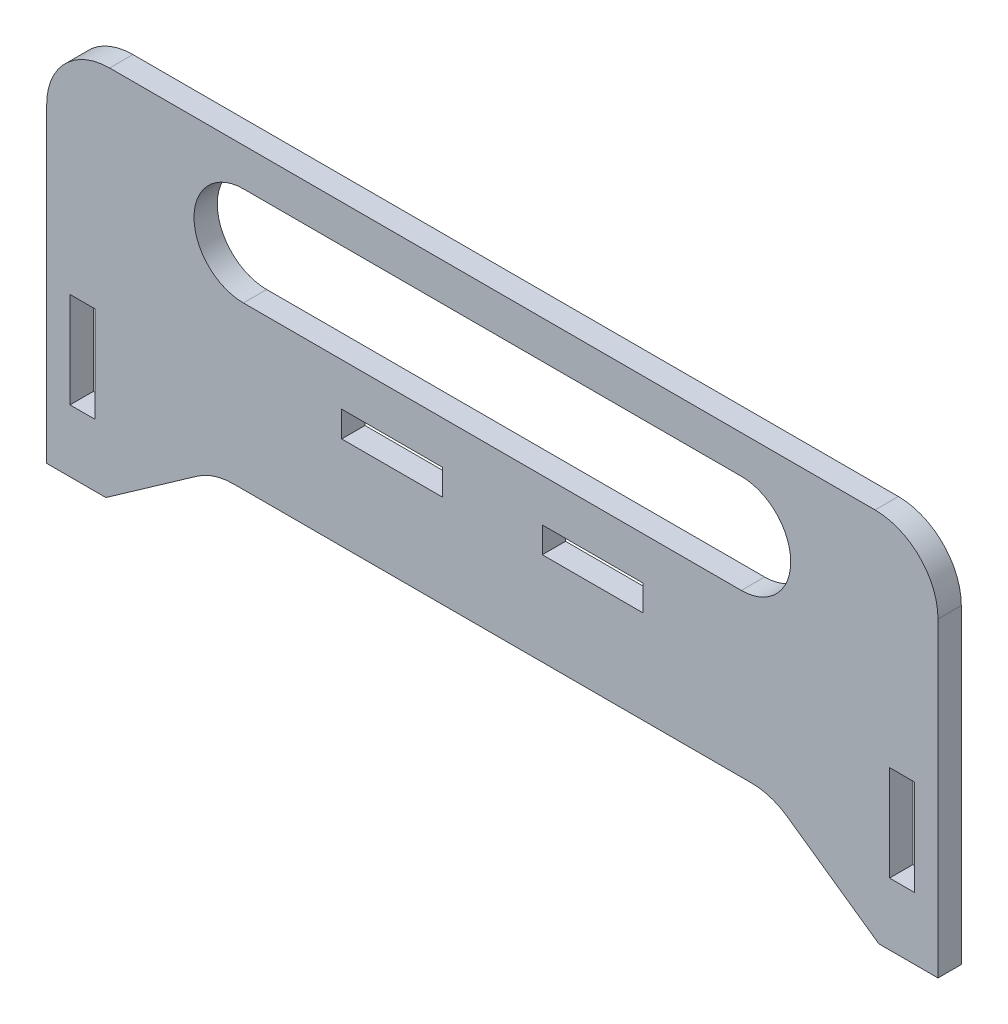
ISO-10303-21;
HEADER;
FILE_DESCRIPTION(('STEP AP214'),'2;1');
FILE_NAME('part.step','',(''),(''),'','','');
FILE_SCHEMA(('AUTOMOTIVE_DESIGN { 1 0 10303 214 1 1 1 1 }'));
ENDSEC;
DATA;
#1=APPLICATION_CONTEXT('core data for automotive mechanical design processes');
#2=APPLICATION_PROTOCOL_DEFINITION('international standard','automotive_design',2000,#1);
#3=PRODUCT_CONTEXT('',#1,'mechanical');
#4=PRODUCT('Part','Part','',(#3));
#5=PRODUCT_RELATED_PRODUCT_CATEGORY('part','',(#4));
#6=PRODUCT_DEFINITION_FORMATION('','',#4);
#7=PRODUCT_DEFINITION_CONTEXT('part definition',#1,'design');
#8=PRODUCT_DEFINITION('design','',#6,#7);
#9=PRODUCT_DEFINITION_SHAPE('','',#8);
#10=(LENGTH_UNIT() NAMED_UNIT(*) SI_UNIT(.MILLI.,.METRE.));
#11=(NAMED_UNIT(*) PLANE_ANGLE_UNIT() SI_UNIT($,.RADIAN.));
#12=(NAMED_UNIT(*) SI_UNIT($,.STERADIAN.) SOLID_ANGLE_UNIT());
#13=UNCERTAINTY_MEASURE_WITH_UNIT(LENGTH_MEASURE(1.E-05),#10,'distance_accuracy_value','');
#14=(GEOMETRIC_REPRESENTATION_CONTEXT(3) GLOBAL_UNCERTAINTY_ASSIGNED_CONTEXT((#13)) GLOBAL_UNIT_ASSIGNED_CONTEXT((#10,
#11,#12)) REPRESENTATION_CONTEXT('',''));
#15=CARTESIAN_POINT('',(0.,0.,0.));
#16=DIRECTION('',(0.,0.,1.));
#17=DIRECTION('',(1.,0.,0.));
#18=AXIS2_PLACEMENT_3D('',#15,#16,#17);
#19=CARTESIAN_POINT('',(0.,0.,3.7));
#20=DIRECTION('',(0.,0.,1.));
#21=DIRECTION('',(1.,0.,0.));
#22=AXIS2_PLACEMENT_3D('',#19,#20,#21);
#23=PLANE('',#22);
#24=DIRECTION('',(-1.,0.,0.));
#25=VECTOR('',#24,1.);
#26=CARTESIAN_POINT('',(-110.178290247756,0.,3.7));
#27=LINE('',#26,#25);
#28=CARTESIAN_POINT('',(21.4217097522439,0.,3.7));
#29=VERTEX_POINT('',#28);
#30=CARTESIAN_POINT('',(-100.178290247756,0.,3.7));
#31=VERTEX_POINT('',#30);
#32=EDGE_CURVE('E427',#29,#31,#27,.T.);
#33=ORIENTED_EDGE('',*,*,#32,.T.);
#34=CARTESIAN_POINT('',(-100.178290247756,-10.,3.7));
#35=DIRECTION('',(0.,0.,1.));
#36=DIRECTION('',(1.,0.,0.));
#37=AXIS2_PLACEMENT_3D('',#34,#35,#36);
#38=CIRCLE('',#37,10.);
#39=CARTESIAN_POINT('',(-110.178290247756,-10.,3.7));
#40=VERTEX_POINT('',#39);
#41=EDGE_CURVE('E473',#31,#40,#38,.T.);
#42=ORIENTED_EDGE('',*,*,#41,.T.);
#43=DIRECTION('',(0.,-1.,0.));
#44=VECTOR('',#43,1.);
#45=CARTESIAN_POINT('',(-110.178290247756,0.,3.7));
#46=LINE('',#45,#44);
#47=CARTESIAN_POINT('',(-110.178290247756,-59.4,3.7));
#48=VERTEX_POINT('',#47);
#49=EDGE_CURVE('E410',#40,#48,#46,.T.);
#50=ORIENTED_EDGE('',*,*,#49,.T.);
#51=DIRECTION('',(1.,0.,0.));
#52=VECTOR('',#51,1.);
#53=CARTESIAN_POINT('',(-110.178290247756,-59.4,3.7));
#54=LINE('',#53,#52);
#55=CARTESIAN_POINT('',(-100.778290247756,-59.4,3.7));
#56=VERTEX_POINT('',#55);
#57=EDGE_CURVE('E412',#48,#56,#54,.T.);
#58=ORIENTED_EDGE('',*,*,#57,.T.);
#59=DIRECTION('',(0.818181818181818,0.574959574576069,0.));
#60=VECTOR('',#59,1.);
#61=CARTESIAN_POINT('',(-100.778290247756,-59.4,3.7));
#62=LINE('',#61,#60);
#63=CARTESIAN_POINT('',(-86.2656083333484,-49.201526709542,3.7));
#64=VERTEX_POINT('',#63);
#65=EDGE_CURVE('E415',#56,#64,#62,.T.);
#66=ORIENTED_EDGE('',*,*,#65,.T.);
#67=CARTESIAN_POINT('',(-80.5160125875877,-57.3833448913602,3.7));
#68=DIRECTION('',(0.,0.,1.));
#69=DIRECTION('',(1.,0.,0.));
#70=AXIS2_PLACEMENT_3D('',#67,#68,#69);
#71=CIRCLE('',#70,10.);
#72=CARTESIAN_POINT('',(-80.5160125875877,-47.3833448913602,3.7));
#73=VERTEX_POINT('',#72);
#74=EDGE_CURVE('E11',#64,#73,#71,.F.);
#75=ORIENTED_EDGE('',*,*,#74,.T.);
#76=DIRECTION('',(1.,0.,0.));
#77=VECTOR('',#76,1.);
#78=CARTESIAN_POINT('',(-83.6782902477561,-47.3833448913602,3.7));
#79=LINE('',#78,#77);
#80=CARTESIAN_POINT('',(1.75943209207553,-47.3833448913602,3.7));
#81=VERTEX_POINT('',#80);
#82=EDGE_CURVE('E417',#73,#81,#79,.T.);
#83=ORIENTED_EDGE('',*,*,#82,.T.);
#84=CARTESIAN_POINT('',(1.75943209207554,-57.3833448913602,3.7));
#85=DIRECTION('',(0.,0.,1.));
#86=DIRECTION('',(1.,0.,0.));
#87=AXIS2_PLACEMENT_3D('',#84,#85,#86);
#88=CIRCLE('',#87,10.);
#89=CARTESIAN_POINT('',(7.50902783783623,-49.201526709542,3.7));
#90=VERTEX_POINT('',#89);
#91=EDGE_CURVE('E488',#81,#90,#88,.F.);
#92=ORIENTED_EDGE('',*,*,#91,.T.);
#93=DIRECTION('',(0.818181818181818,-0.574959574576069,0.));
#94=VECTOR('',#93,1.);
#95=CARTESIAN_POINT('',(4.92170975224391,-47.3833448913602,3.7));
#96=LINE('',#95,#94);
#97=CARTESIAN_POINT('',(22.0217097522439,-59.4,3.7));
#98=VERTEX_POINT('',#97);
#99=EDGE_CURVE('E420',#90,#98,#96,.T.);
#100=ORIENTED_EDGE('',*,*,#99,.T.);
#101=DIRECTION('',(1.,0.,0.));
#102=VECTOR('',#101,1.);
#103=CARTESIAN_POINT('',(22.0217097522439,-59.4,3.7));
#104=LINE('',#103,#102);
#105=CARTESIAN_POINT('',(31.4217097522439,-59.4,3.7));
#106=VERTEX_POINT('',#105);
#107=EDGE_CURVE('E422',#98,#106,#104,.T.);
#108=ORIENTED_EDGE('',*,*,#107,.T.);
#109=DIRECTION('',(0.,1.,0.));
#110=VECTOR('',#109,1.);
#111=CARTESIAN_POINT('',(31.4217097522439,0.,3.7));
#112=LINE('',#111,#110);
#113=CARTESIAN_POINT('',(31.4217097522439,-10.,3.7));
#114=VERTEX_POINT('',#113);
#115=EDGE_CURVE('E424',#106,#114,#112,.T.);
#116=ORIENTED_EDGE('',*,*,#115,.T.);
#117=CARTESIAN_POINT('',(21.4217097522439,-10.,3.7));
#118=DIRECTION('',(0.,0.,1.));
#119=DIRECTION('',(1.,0.,0.));
#120=AXIS2_PLACEMENT_3D('',#117,#118,#119);
#121=CIRCLE('',#120,10.);
#122=EDGE_CURVE('E471',#114,#29,#121,.T.);
#123=ORIENTED_EDGE('',*,*,#122,.T.);
#124=EDGE_LOOP('',(#33,#42,#50,#58,#66,#75,#83,#92,#100,#108,#116,#123));
#125=FACE_BOUND('',#124,.T.);
#126=DIRECTION('',(-1.,0.,0.));
#127=VECTOR('',#126,1.);
#128=CARTESIAN_POINT('',(0.171709752243898,-5.99999999999999,3.7));
#129=LINE('',#128,#127);
#130=CARTESIAN_POINT('',(0.171709752243898,-5.99999999999999,3.7));
#131=VERTEX_POINT('',#130);
#132=CARTESIAN_POINT('',(-78.9282902477561,-5.99999999999999,3.7));
#133=VERTEX_POINT('',#132);
#134=EDGE_CURVE('E381',#131,#133,#129,.T.);
#135=ORIENTED_EDGE('',*,*,#134,.F.);
#136=CARTESIAN_POINT('',(0.171709752243897,-13.85,3.7));
#137=DIRECTION('',(0.,0.,1.));
#138=DIRECTION('',(1.,0.,0.));
#139=AXIS2_PLACEMENT_3D('',#136,#137,#138);
#140=CIRCLE('',#139,7.84999999999999);
#141=CARTESIAN_POINT('',(0.171709752243898,-21.7,3.7));
#142=VERTEX_POINT('',#141);
#143=EDGE_CURVE('E379',#142,#131,#140,.T.);
#144=ORIENTED_EDGE('',*,*,#143,.F.);
#145=DIRECTION('',(1.,0.,0.));
#146=VECTOR('',#145,1.);
#147=CARTESIAN_POINT('',(0.171709752243898,-21.7,3.7));
#148=LINE('',#147,#146);
#149=CARTESIAN_POINT('',(-78.9282902477561,-21.7,3.7));
#150=VERTEX_POINT('',#149);
#151=EDGE_CURVE('E387',#150,#142,#148,.T.);
#152=ORIENTED_EDGE('',*,*,#151,.F.);
#153=CARTESIAN_POINT('',(-78.9282902477561,-13.85,3.7));
#154=DIRECTION('',(0.,0.,1.));
#155=DIRECTION('',(1.,0.,0.));
#156=AXIS2_PLACEMENT_3D('',#153,#154,#155);
#157=CIRCLE('',#156,7.84999999999999);
#158=EDGE_CURVE('E384',#133,#150,#157,.T.);
#159=ORIENTED_EDGE('',*,*,#158,.F.);
#160=EDGE_LOOP('',(#135,#144,#152,#159));
#161=FACE_BOUND('',#160,.T.);
#162=DIRECTION('',(1.,0.,0.));
#163=VECTOR('',#162,1.);
#164=CARTESIAN_POINT('',(-47.3107902477561,-32.6,3.7));
#165=LINE('',#164,#163);
#166=CARTESIAN_POINT('',(-63.3107902477561,-32.6,3.7));
#167=VERTEX_POINT('',#166);
#168=CARTESIAN_POINT('',(-47.3107902477561,-32.6,3.7));
#169=VERTEX_POINT('',#168);
#170=EDGE_CURVE('E350',#167,#169,#165,.T.);
#171=ORIENTED_EDGE('',*,*,#170,.F.);
#172=DIRECTION('',(0.,-1.,0.));
#173=VECTOR('',#172,1.);
#174=CARTESIAN_POINT('',(-63.3107902477561,-32.6,3.7));
#175=LINE('',#174,#173);
#176=CARTESIAN_POINT('',(-63.3107902477561,-28.5,3.7));
#177=VERTEX_POINT('',#176);
#178=EDGE_CURVE('E348',#177,#167,#175,.T.);
#179=ORIENTED_EDGE('',*,*,#178,.F.);
#180=DIRECTION('',(-1.,0.,0.));
#181=VECTOR('',#180,1.);
#182=CARTESIAN_POINT('',(-47.3107902477561,-28.5,3.7));
#183=LINE('',#182,#181);
#184=CARTESIAN_POINT('',(-47.3107902477561,-28.5,3.7));
#185=VERTEX_POINT('',#184);
#186=EDGE_CURVE('E356',#185,#177,#183,.T.);
#187=ORIENTED_EDGE('',*,*,#186,.F.);
#188=DIRECTION('',(0.,1.,0.));
#189=VECTOR('',#188,1.);
#190=CARTESIAN_POINT('',(-47.3107902477561,-32.6,3.7));
#191=LINE('',#190,#189);
#192=EDGE_CURVE('E353',#169,#185,#191,.T.);
#193=ORIENTED_EDGE('',*,*,#192,.F.);
#194=EDGE_LOOP('',(#171,#179,#187,#193));
#195=FACE_BOUND('',#194,.T.);
#196=DIRECTION('',(0.,1.,0.));
#197=VECTOR('',#196,1.);
#198=CARTESIAN_POINT('',(-15.4457902477561,-32.6,3.7));
#199=LINE('',#198,#197);
#200=CARTESIAN_POINT('',(-15.4457902477561,-32.6,3.7));
#201=VERTEX_POINT('',#200);
#202=CARTESIAN_POINT('',(-15.4457902477561,-28.5,3.7));
#203=VERTEX_POINT('',#202);
#204=EDGE_CURVE('E319',#201,#203,#199,.T.);
#205=ORIENTED_EDGE('',*,*,#204,.F.);
#206=DIRECTION('',(1.,0.,0.));
#207=VECTOR('',#206,1.);
#208=CARTESIAN_POINT('',(-31.4457902477561,-32.6,3.7));
#209=LINE('',#208,#207);
#210=CARTESIAN_POINT('',(-31.4457902477561,-32.6,3.7));
#211=VERTEX_POINT('',#210);
#212=EDGE_CURVE('E317',#211,#201,#209,.T.);
#213=ORIENTED_EDGE('',*,*,#212,.F.);
#214=DIRECTION('',(0.,-1.,0.));
#215=VECTOR('',#214,1.);
#216=CARTESIAN_POINT('',(-31.4457902477561,-32.6,3.7));
#217=LINE('',#216,#215);
#218=CARTESIAN_POINT('',(-31.4457902477561,-28.5,3.7));
#219=VERTEX_POINT('',#218);
#220=EDGE_CURVE('E325',#219,#211,#217,.T.);
#221=ORIENTED_EDGE('',*,*,#220,.F.);
#222=DIRECTION('',(-1.,0.,0.));
#223=VECTOR('',#222,1.);
#224=CARTESIAN_POINT('',(-31.4457902477561,-28.5,3.7));
#225=LINE('',#224,#223);
#226=EDGE_CURVE('E322',#203,#219,#225,.T.);
#227=ORIENTED_EDGE('',*,*,#226,.F.);
#228=EDGE_LOOP('',(#205,#213,#221,#227));
#229=FACE_BOUND('',#228,.T.);
#230=DIRECTION('',(-1.,0.,0.));
#231=VECTOR('',#230,1.);
#232=CARTESIAN_POINT('',(-106.478290247756,-34.3,3.7));
#233=LINE('',#232,#231);
#234=CARTESIAN_POINT('',(-102.478290247756,-34.3,3.7));
#235=VERTEX_POINT('',#234);
#236=CARTESIAN_POINT('',(-106.478290247756,-34.3,3.7));
#237=VERTEX_POINT('',#236);
#238=EDGE_CURVE('E288',#235,#237,#233,.T.);
#239=ORIENTED_EDGE('',*,*,#238,.F.);
#240=DIRECTION('',(0.,1.,0.));
#241=VECTOR('',#240,1.);
#242=CARTESIAN_POINT('',(-102.478290247756,-34.3,3.7));
#243=LINE('',#242,#241);
#244=CARTESIAN_POINT('',(-102.478290247756,-49.5,3.7));
#245=VERTEX_POINT('',#244);
#246=EDGE_CURVE('E286',#245,#235,#243,.T.);
#247=ORIENTED_EDGE('',*,*,#246,.F.);
#248=DIRECTION('',(1.,0.,0.));
#249=VECTOR('',#248,1.);
#250=CARTESIAN_POINT('',(-106.478290247756,-49.5,3.7));
#251=LINE('',#250,#249);
#252=CARTESIAN_POINT('',(-106.478290247756,-49.5,3.7));
#253=VERTEX_POINT('',#252);
#254=EDGE_CURVE('E294',#253,#245,#251,.T.);
#255=ORIENTED_EDGE('',*,*,#254,.F.);
#256=DIRECTION('',(0.,-1.,0.));
#257=VECTOR('',#256,1.);
#258=CARTESIAN_POINT('',(-106.478290247756,-34.3,3.7));
#259=LINE('',#258,#257);
#260=EDGE_CURVE('E291',#237,#253,#259,.T.);
#261=ORIENTED_EDGE('',*,*,#260,.F.);
#262=EDGE_LOOP('',(#239,#247,#255,#261));
#263=FACE_BOUND('',#262,.T.);
#264=DIRECTION('',(-1.,0.,0.));
#265=VECTOR('',#264,1.);
#266=CARTESIAN_POINT('',(27.7217097522439,-34.3,3.7));
#267=LINE('',#266,#265);
#268=CARTESIAN_POINT('',(27.7217097522439,-34.3,3.7));
#269=VERTEX_POINT('',#268);
#270=CARTESIAN_POINT('',(23.7217097522439,-34.3,3.7));
#271=VERTEX_POINT('',#270);
#272=EDGE_CURVE('E255',#269,#271,#267,.T.);
#273=ORIENTED_EDGE('',*,*,#272,.F.);
#274=DIRECTION('',(0.,1.,0.));
#275=VECTOR('',#274,1.);
#276=CARTESIAN_POINT('',(27.7217097522439,-34.3,3.7));
#277=LINE('',#276,#275);
#278=CARTESIAN_POINT('',(27.7217097522439,-49.5,3.7));
#279=VERTEX_POINT('',#278);
#280=EDGE_CURVE('E245',#279,#269,#277,.T.);
#281=ORIENTED_EDGE('',*,*,#280,.F.);
#282=DIRECTION('',(1.,0.,0.));
#283=VECTOR('',#282,1.);
#284=CARTESIAN_POINT('',(27.7217097522439,-49.5,3.7));
#285=LINE('',#284,#283);
#286=CARTESIAN_POINT('',(23.7217097522439,-49.5,3.7));
#287=VERTEX_POINT('',#286);
#288=EDGE_CURVE('E270',#287,#279,#285,.T.);
#289=ORIENTED_EDGE('',*,*,#288,.F.);
#290=DIRECTION('',(0.,-1.,0.));
#291=VECTOR('',#290,1.);
#292=CARTESIAN_POINT('',(23.7217097522439,-34.3,3.7));
#293=LINE('',#292,#291);
#294=EDGE_CURVE('E268',#271,#287,#293,.T.);
#295=ORIENTED_EDGE('',*,*,#294,.F.);
#296=EDGE_LOOP('',(#273,#281,#289,#295));
#297=FACE_BOUND('',#296,.T.);
#298=ADVANCED_FACE('F35',(#125,#161,#195,#229,#263,#297),#23,.T.);
#299=CARTESIAN_POINT('',(0.,0.,0.));
#300=DIRECTION('',(0.,0.,1.));
#301=DIRECTION('',(1.,0.,0.));
#302=AXIS2_PLACEMENT_3D('',#299,#300,#301);
#303=PLANE('',#302);
#304=DIRECTION('',(0.,1.,0.));
#305=VECTOR('',#304,1.);
#306=CARTESIAN_POINT('',(-102.478290247756,-34.3,0.));
#307=LINE('',#306,#305);
#308=CARTESIAN_POINT('',(-102.478290247756,-49.5,0.));
#309=VERTEX_POINT('',#308);
#310=CARTESIAN_POINT('',(-102.478290247756,-34.3,0.));
#311=VERTEX_POINT('',#310);
#312=EDGE_CURVE('E263',#309,#311,#307,.T.);
#313=ORIENTED_EDGE('',*,*,#312,.T.);
#314=DIRECTION('',(-1.,0.,0.));
#315=VECTOR('',#314,1.);
#316=CARTESIAN_POINT('',(-106.478290247756,-34.3,0.));
#317=LINE('',#316,#315);
#318=CARTESIAN_POINT('',(-106.478290247756,-34.3,0.));
#319=VERTEX_POINT('',#318);
#320=EDGE_CURVE('E299',#311,#319,#317,.T.);
#321=ORIENTED_EDGE('',*,*,#320,.T.);
#322=DIRECTION('',(0.,-1.,0.));
#323=VECTOR('',#322,1.);
#324=CARTESIAN_POINT('',(-106.478290247756,-34.3,0.));
#325=LINE('',#324,#323);
#326=CARTESIAN_POINT('',(-106.478290247756,-49.5,0.));
#327=VERTEX_POINT('',#326);
#328=EDGE_CURVE('E302',#319,#327,#325,.T.);
#329=ORIENTED_EDGE('',*,*,#328,.T.);
#330=DIRECTION('',(1.,0.,0.));
#331=VECTOR('',#330,1.);
#332=CARTESIAN_POINT('',(-106.478290247756,-49.5,0.));
#333=LINE('',#332,#331);
#334=EDGE_CURVE('E289',#327,#309,#333,.T.);
#335=ORIENTED_EDGE('',*,*,#334,.T.);
#336=EDGE_LOOP('',(#313,#321,#329,#335));
#337=FACE_BOUND('',#336,.T.);
#338=DIRECTION('',(0.,-1.,0.));
#339=VECTOR('',#338,1.);
#340=CARTESIAN_POINT('',(-63.3107902477561,-32.6,0.));
#341=LINE('',#340,#339);
#342=CARTESIAN_POINT('',(-63.3107902477561,-28.5,0.));
#343=VERTEX_POINT('',#342);
#344=CARTESIAN_POINT('',(-63.3107902477561,-32.6,0.));
#345=VERTEX_POINT('',#344);
#346=EDGE_CURVE('E347',#343,#345,#341,.T.);
#347=ORIENTED_EDGE('',*,*,#346,.T.);
#348=DIRECTION('',(1.,0.,0.));
#349=VECTOR('',#348,1.);
#350=CARTESIAN_POINT('',(-47.3107902477561,-32.6,0.));
#351=LINE('',#350,#349);
#352=CARTESIAN_POINT('',(-47.3107902477561,-32.6,0.));
#353=VERTEX_POINT('',#352);
#354=EDGE_CURVE('E361',#345,#353,#351,.T.);
#355=ORIENTED_EDGE('',*,*,#354,.T.);
#356=DIRECTION('',(0.,1.,0.));
#357=VECTOR('',#356,1.);
#358=CARTESIAN_POINT('',(-47.3107902477561,-32.6,0.));
#359=LINE('',#358,#357);
#360=CARTESIAN_POINT('',(-47.3107902477561,-28.5,0.));
#361=VERTEX_POINT('',#360);
#362=EDGE_CURVE('E364',#353,#361,#359,.T.);
#363=ORIENTED_EDGE('',*,*,#362,.T.);
#364=DIRECTION('',(-1.,0.,0.));
#365=VECTOR('',#364,1.);
#366=CARTESIAN_POINT('',(-47.3107902477561,-28.5,0.));
#367=LINE('',#366,#365);
#368=EDGE_CURVE('E351',#361,#343,#367,.T.);
#369=ORIENTED_EDGE('',*,*,#368,.T.);
#370=EDGE_LOOP('',(#347,#355,#363,#369));
#371=FACE_BOUND('',#370,.T.);
#372=DIRECTION('',(0.,-1.,0.));
#373=VECTOR('',#372,1.);
#374=CARTESIAN_POINT('',(-110.178290247756,0.,0.));
#375=LINE('',#374,#373);
#376=CARTESIAN_POINT('',(-110.178290247756,-10.,0.));
#377=VERTEX_POINT('',#376);
#378=CARTESIAN_POINT('',(-110.178290247756,-59.4,0.));
#379=VERTEX_POINT('',#378);
#380=EDGE_CURVE('E409',#377,#379,#375,.T.);
#381=ORIENTED_EDGE('',*,*,#380,.F.);
#382=CARTESIAN_POINT('',(-100.178290247756,-10.,0.));
#383=DIRECTION('',(0.,0.,1.));
#384=DIRECTION('',(1.,0.,0.));
#385=AXIS2_PLACEMENT_3D('',#382,#383,#384);
#386=CIRCLE('',#385,10.);
#387=CARTESIAN_POINT('',(-100.178290247756,0.,0.));
#388=VERTEX_POINT('',#387);
#389=EDGE_CURVE('E464',#377,#388,#386,.F.);
#390=ORIENTED_EDGE('',*,*,#389,.T.);
#391=DIRECTION('',(-1.,0.,0.));
#392=VECTOR('',#391,1.);
#393=CARTESIAN_POINT('',(-110.178290247756,0.,0.));
#394=LINE('',#393,#392);
#395=CARTESIAN_POINT('',(21.4217097522439,0.,0.));
#396=VERTEX_POINT('',#395);
#397=EDGE_CURVE('E413',#396,#388,#394,.T.);
#398=ORIENTED_EDGE('',*,*,#397,.F.);
#399=CARTESIAN_POINT('',(21.4217097522439,-10.,0.));
#400=DIRECTION('',(0.,0.,1.));
#401=DIRECTION('',(1.,0.,0.));
#402=AXIS2_PLACEMENT_3D('',#399,#400,#401);
#403=CIRCLE('',#402,10.);
#404=CARTESIAN_POINT('',(31.4217097522439,-10.,0.));
#405=VERTEX_POINT('',#404);
#406=EDGE_CURVE('E462',#396,#405,#403,.F.);
#407=ORIENTED_EDGE('',*,*,#406,.T.);
#408=DIRECTION('',(0.,1.,0.));
#409=VECTOR('',#408,1.);
#410=CARTESIAN_POINT('',(31.4217097522439,0.,0.));
#411=LINE('',#410,#409);
#412=CARTESIAN_POINT('',(31.4217097522439,-59.4,0.));
#413=VERTEX_POINT('',#412);
#414=EDGE_CURVE('E443',#413,#405,#411,.T.);
#415=ORIENTED_EDGE('',*,*,#414,.F.);
#416=DIRECTION('',(1.,0.,0.));
#417=VECTOR('',#416,1.);
#418=CARTESIAN_POINT('',(22.0217097522439,-59.4,0.));
#419=LINE('',#418,#417);
#420=CARTESIAN_POINT('',(22.0217097522439,-59.4,0.));
#421=VERTEX_POINT('',#420);
#422=EDGE_CURVE('E441',#421,#413,#419,.T.);
#423=ORIENTED_EDGE('',*,*,#422,.F.);
#424=DIRECTION('',(0.818181818181818,-0.574959574576069,0.));
#425=VECTOR('',#424,1.);
#426=CARTESIAN_POINT('',(4.92170975224391,-47.3833448913602,0.));
#427=LINE('',#426,#425);
#428=CARTESIAN_POINT('',(7.50902783783623,-49.201526709542,0.));
#429=VERTEX_POINT('',#428);
#430=EDGE_CURVE('E439',#429,#421,#427,.T.);
#431=ORIENTED_EDGE('',*,*,#430,.F.);
#432=CARTESIAN_POINT('',(1.75943209207554,-57.3833448913602,0.));
#433=DIRECTION('',(0.,0.,1.));
#434=DIRECTION('',(1.,0.,0.));
#435=AXIS2_PLACEMENT_3D('',#432,#433,#434);
#436=CIRCLE('',#435,10.);
#437=CARTESIAN_POINT('',(1.75943209207553,-47.3833448913602,0.));
#438=VERTEX_POINT('',#437);
#439=EDGE_CURVE('E486',#429,#438,#436,.T.);
#440=ORIENTED_EDGE('',*,*,#439,.T.);
#441=DIRECTION('',(1.,0.,0.));
#442=VECTOR('',#441,1.);
#443=CARTESIAN_POINT('',(-83.6782902477561,-47.3833448913602,0.));
#444=LINE('',#443,#442);
#445=CARTESIAN_POINT('',(-80.5160125875877,-47.3833448913602,0.));
#446=VERTEX_POINT('',#445);
#447=EDGE_CURVE('E436',#446,#438,#444,.T.);
#448=ORIENTED_EDGE('',*,*,#447,.F.);
#449=CARTESIAN_POINT('',(-80.5160125875877,-57.3833448913602,0.));
#450=DIRECTION('',(0.,0.,1.));
#451=DIRECTION('',(1.,0.,0.));
#452=AXIS2_PLACEMENT_3D('',#449,#450,#451);
#453=CIRCLE('',#452,10.);
#454=CARTESIAN_POINT('',(-86.2656083333484,-49.201526709542,0.));
#455=VERTEX_POINT('',#454);
#456=EDGE_CURVE('E43',#446,#455,#453,.T.);
#457=ORIENTED_EDGE('',*,*,#456,.T.);
#458=DIRECTION('',(0.818181818181818,0.574959574576069,0.));
#459=VECTOR('',#458,1.);
#460=CARTESIAN_POINT('',(-100.778290247756,-59.4,0.));
#461=LINE('',#460,#459);
#462=CARTESIAN_POINT('',(-100.778290247756,-59.4,0.));
#463=VERTEX_POINT('',#462);
#464=EDGE_CURVE('E434',#463,#455,#461,.T.);
#465=ORIENTED_EDGE('',*,*,#464,.F.);
#466=DIRECTION('',(1.,0.,0.));
#467=VECTOR('',#466,1.);
#468=CARTESIAN_POINT('',(-110.178290247756,-59.4,0.));
#469=LINE('',#468,#467);
#470=EDGE_CURVE('E432',#379,#463,#469,.T.);
#471=ORIENTED_EDGE('',*,*,#470,.F.);
#472=EDGE_LOOP('',(#381,#390,#398,#407,#415,#423,#431,#440,#448,#457,#465,#471));
#473=FACE_BOUND('',#472,.T.);
#474=CARTESIAN_POINT('',(0.171709752243897,-13.85,0.));
#475=DIRECTION('',(0.,0.,1.));
#476=DIRECTION('',(1.,0.,0.));
#477=AXIS2_PLACEMENT_3D('',#474,#475,#476);
#478=CIRCLE('',#477,7.84999999999999);
#479=CARTESIAN_POINT('',(0.171709752243898,-21.7,0.));
#480=VERTEX_POINT('',#479);
#481=CARTESIAN_POINT('',(0.171709752243898,-5.99999999999999,0.));
#482=VERTEX_POINT('',#481);
#483=EDGE_CURVE('E378',#480,#482,#478,.T.);
#484=ORIENTED_EDGE('',*,*,#483,.T.);
#485=DIRECTION('',(-1.,0.,0.));
#486=VECTOR('',#485,1.);
#487=CARTESIAN_POINT('',(0.171709752243898,-5.99999999999999,0.));
#488=LINE('',#487,#486);
#489=CARTESIAN_POINT('',(-78.9282902477561,-5.99999999999999,0.));
#490=VERTEX_POINT('',#489);
#491=EDGE_CURVE('E392',#482,#490,#488,.T.);
#492=ORIENTED_EDGE('',*,*,#491,.T.);
#493=CARTESIAN_POINT('',(-78.9282902477561,-13.85,0.));
#494=DIRECTION('',(0.,0.,1.));
#495=DIRECTION('',(1.,0.,0.));
#496=AXIS2_PLACEMENT_3D('',#493,#494,#495);
#497=CIRCLE('',#496,7.84999999999999);
#498=CARTESIAN_POINT('',(-78.9282902477561,-21.7,0.));
#499=VERTEX_POINT('',#498);
#500=EDGE_CURVE('E395',#490,#499,#497,.T.);
#501=ORIENTED_EDGE('',*,*,#500,.T.);
#502=DIRECTION('',(1.,0.,0.));
#503=VECTOR('',#502,1.);
#504=CARTESIAN_POINT('',(0.171709752243898,-21.7,0.));
#505=LINE('',#504,#503);
#506=EDGE_CURVE('E382',#499,#480,#505,.T.);
#507=ORIENTED_EDGE('',*,*,#506,.T.);
#508=EDGE_LOOP('',(#484,#492,#501,#507));
#509=FACE_BOUND('',#508,.T.);
#510=DIRECTION('',(1.,0.,0.));
#511=VECTOR('',#510,1.);
#512=CARTESIAN_POINT('',(-31.4457902477561,-32.6,0.));
#513=LINE('',#512,#511);
#514=CARTESIAN_POINT('',(-31.4457902477561,-32.6,0.));
#515=VERTEX_POINT('',#514);
#516=CARTESIAN_POINT('',(-15.4457902477561,-32.6,0.));
#517=VERTEX_POINT('',#516);
#518=EDGE_CURVE('E316',#515,#517,#513,.T.);
#519=ORIENTED_EDGE('',*,*,#518,.T.);
#520=DIRECTION('',(0.,1.,0.));
#521=VECTOR('',#520,1.);
#522=CARTESIAN_POINT('',(-15.4457902477561,-32.6,0.));
#523=LINE('',#522,#521);
#524=CARTESIAN_POINT('',(-15.4457902477561,-28.5,0.));
#525=VERTEX_POINT('',#524);
#526=EDGE_CURVE('E330',#517,#525,#523,.T.);
#527=ORIENTED_EDGE('',*,*,#526,.T.);
#528=DIRECTION('',(-1.,0.,0.));
#529=VECTOR('',#528,1.);
#530=CARTESIAN_POINT('',(-31.4457902477561,-28.5,0.));
#531=LINE('',#530,#529);
#532=CARTESIAN_POINT('',(-31.4457902477561,-28.5,0.));
#533=VERTEX_POINT('',#532);
#534=EDGE_CURVE('E333',#525,#533,#531,.T.);
#535=ORIENTED_EDGE('',*,*,#534,.T.);
#536=DIRECTION('',(0.,-1.,0.));
#537=VECTOR('',#536,1.);
#538=CARTESIAN_POINT('',(-31.4457902477561,-32.6,0.));
#539=LINE('',#538,#537);
#540=EDGE_CURVE('E320',#533,#515,#539,.T.);
#541=ORIENTED_EDGE('',*,*,#540,.T.);
#542=EDGE_LOOP('',(#519,#527,#535,#541));
#543=FACE_BOUND('',#542,.T.);
#544=DIRECTION('',(0.,1.,0.));
#545=VECTOR('',#544,1.);
#546=CARTESIAN_POINT('',(27.7217097522439,-34.3,0.));
#547=LINE('',#546,#545);
#548=CARTESIAN_POINT('',(27.7217097522439,-49.5,0.));
#549=VERTEX_POINT('',#548);
#550=CARTESIAN_POINT('',(27.7217097522439,-34.3,0.));
#551=VERTEX_POINT('',#550);
#552=EDGE_CURVE('E274',#549,#551,#547,.T.);
#553=ORIENTED_EDGE('',*,*,#552,.T.);
#554=DIRECTION('',(-1.,0.,0.));
#555=VECTOR('',#554,1.);
#556=CARTESIAN_POINT('',(27.7217097522439,-34.3,0.));
#557=LINE('',#556,#555);
#558=CARTESIAN_POINT('',(23.7217097522439,-34.3,0.));
#559=VERTEX_POINT('',#558);
#560=EDGE_CURVE('E262',#551,#559,#557,.T.);
#561=ORIENTED_EDGE('',*,*,#560,.T.);
#562=DIRECTION('',(0.,-1.,0.));
#563=VECTOR('',#562,1.);
#564=CARTESIAN_POINT('',(23.7217097522439,-34.3,0.));
#565=LINE('',#564,#563);
#566=CARTESIAN_POINT('',(23.7217097522439,-49.5,0.));
#567=VERTEX_POINT('',#566);
#568=EDGE_CURVE('E277',#559,#567,#565,.T.);
#569=ORIENTED_EDGE('',*,*,#568,.T.);
#570=DIRECTION('',(1.,0.,0.));
#571=VECTOR('',#570,1.);
#572=CARTESIAN_POINT('',(27.7217097522439,-49.5,0.));
#573=LINE('',#572,#571);
#574=EDGE_CURVE('E256',#567,#549,#573,.T.);
#575=ORIENTED_EDGE('',*,*,#574,.T.);
#576=EDGE_LOOP('',(#553,#561,#569,#575));
#577=FACE_BOUND('',#576,.T.);
#578=ADVANCED_FACE('F504',(#337,#371,#473,#509,#543,#577),#303,.F.);
#579=CARTESIAN_POINT('',(-110.178290247756,0.,3.7));
#580=DIRECTION('',(1.,0.,0.));
#581=DIRECTION('',(0.,0.,-1.));
#582=AXIS2_PLACEMENT_3D('',#579,#580,#581);
#583=PLANE('',#582);
#584=ORIENTED_EDGE('',*,*,#49,.F.);
#585=DIRECTION('',(0.,0.,-1.));
#586=VECTOR('',#585,1.);
#587=CARTESIAN_POINT('',(-110.178290247756,-10.,3.7));
#588=LINE('',#587,#586);
#589=EDGE_CURVE('E459',#40,#377,#588,.T.);
#590=ORIENTED_EDGE('',*,*,#589,.T.);
#591=ORIENTED_EDGE('',*,*,#380,.T.);
#592=DIRECTION('',(0.,0.,-1.));
#593=VECTOR('',#592,1.);
#594=CARTESIAN_POINT('',(-110.178290247756,-59.4,3.7));
#595=LINE('',#594,#593);
#596=EDGE_CURVE('E456',#48,#379,#595,.T.);
#597=ORIENTED_EDGE('',*,*,#596,.F.);
#598=EDGE_LOOP('',(#584,#590,#591,#597));
#599=FACE_BOUND('',#598,.T.);
#600=ADVANCED_FACE('F521',(#599),#583,.F.);
#601=CARTESIAN_POINT('',(-110.178290247756,-59.4,3.7));
#602=DIRECTION('',(0.,1.,0.));
#603=DIRECTION('',(0.,0.,1.));
#604=AXIS2_PLACEMENT_3D('',#601,#602,#603);
#605=PLANE('',#604);
#606=ORIENTED_EDGE('',*,*,#470,.T.);
#607=DIRECTION('',(0.,0.,-1.));
#608=VECTOR('',#607,1.);
#609=CARTESIAN_POINT('',(-100.778290247756,-59.4,3.7));
#610=LINE('',#609,#608);
#611=EDGE_CURVE('E453',#56,#463,#610,.T.);
#612=ORIENTED_EDGE('',*,*,#611,.F.);
#613=ORIENTED_EDGE('',*,*,#57,.F.);
#614=ORIENTED_EDGE('',*,*,#596,.T.);
#615=EDGE_LOOP('',(#606,#612,#613,#614));
#616=FACE_BOUND('',#615,.T.);
#617=ADVANCED_FACE('F518',(#616),#605,.F.);
#618=CARTESIAN_POINT('',(-100.778290247756,-59.4,3.7));
#619=DIRECTION('',(-0.574959574576069,0.818181818181818,0.));
#620=DIRECTION('',(-0.818181818181818,-0.574959574576069,0.));
#621=AXIS2_PLACEMENT_3D('',#618,#619,#620);
#622=PLANE('',#621);
#623=ORIENTED_EDGE('',*,*,#464,.T.);
#624=DIRECTION('',(0.,0.,-1.));
#625=VECTOR('',#624,1.);
#626=CARTESIAN_POINT('',(-86.2656083333484,-49.201526709542,3.7));
#627=LINE('',#626,#625);
#628=EDGE_CURVE('E50',#455,#64,#627,.F.);
#629=ORIENTED_EDGE('',*,*,#628,.T.);
#630=ORIENTED_EDGE('',*,*,#65,.F.);
#631=ORIENTED_EDGE('',*,*,#611,.T.);
#632=EDGE_LOOP('',(#623,#629,#630,#631));
#633=FACE_BOUND('',#632,.T.);
#634=ADVANCED_FACE('F514',(#633),#622,.F.);
#635=CARTESIAN_POINT('',(-83.6782902477561,-47.3833448913602,3.7));
#636=DIRECTION('',(0.,1.,0.));
#637=DIRECTION('',(0.,0.,1.));
#638=AXIS2_PLACEMENT_3D('',#635,#636,#637);
#639=PLANE('',#638);
#640=ORIENTED_EDGE('',*,*,#447,.T.);
#641=DIRECTION('',(0.,0.,-1.));
#642=VECTOR('',#641,1.);
#643=CARTESIAN_POINT('',(1.75943209207554,-47.3833448913602,3.7));
#644=LINE('',#643,#642);
#645=EDGE_CURVE('E483',#438,#81,#644,.F.);
#646=ORIENTED_EDGE('',*,*,#645,.T.);
#647=ORIENTED_EDGE('',*,*,#82,.F.);
#648=DIRECTION('',(0.,0.,-1.));
#649=VECTOR('',#648,1.);
#650=CARTESIAN_POINT('',(-80.5160125875877,-47.3833448913602,0.));
#651=LINE('',#650,#649);
#652=EDGE_CURVE('E480',#73,#446,#651,.T.);
#653=ORIENTED_EDGE('',*,*,#652,.T.);
#654=EDGE_LOOP('',(#640,#646,#647,#653));
#655=FACE_BOUND('',#654,.T.);
#656=ADVANCED_FACE('F508',(#655),#639,.F.);
#657=CARTESIAN_POINT('',(4.92170975224391,-47.3833448913602,3.7));
#658=DIRECTION('',(0.574959574576069,0.818181818181818,0.));
#659=DIRECTION('',(-0.818181818181818,0.574959574576069,0.));
#660=AXIS2_PLACEMENT_3D('',#657,#658,#659);
#661=PLANE('',#660);
#662=ORIENTED_EDGE('',*,*,#99,.F.);
#663=DIRECTION('',(0.,0.,-1.));
#664=VECTOR('',#663,1.);
#665=CARTESIAN_POINT('',(7.50902783783623,-49.201526709542,0.));
#666=LINE('',#665,#664);
#667=EDGE_CURVE('E477',#90,#429,#666,.T.);
#668=ORIENTED_EDGE('',*,*,#667,.T.);
#669=ORIENTED_EDGE('',*,*,#430,.T.);
#670=DIRECTION('',(0.,0.,-1.));
#671=VECTOR('',#670,1.);
#672=CARTESIAN_POINT('',(22.0217097522439,-59.4,3.7));
#673=LINE('',#672,#671);
#674=EDGE_CURVE('E450',#98,#421,#673,.T.);
#675=ORIENTED_EDGE('',*,*,#674,.F.);
#676=EDGE_LOOP('',(#662,#668,#669,#675));
#677=FACE_BOUND('',#676,.T.);
#678=ADVANCED_FACE('F499',(#677),#661,.F.);
#679=CARTESIAN_POINT('',(22.0217097522439,-59.4,3.7));
#680=DIRECTION('',(0.,1.,0.));
#681=DIRECTION('',(0.,0.,1.));
#682=AXIS2_PLACEMENT_3D('',#679,#680,#681);
#683=PLANE('',#682);
#684=ORIENTED_EDGE('',*,*,#422,.T.);
#685=DIRECTION('',(0.,0.,-1.));
#686=VECTOR('',#685,1.);
#687=CARTESIAN_POINT('',(31.4217097522439,-59.4,3.7));
#688=LINE('',#687,#686);
#689=EDGE_CURVE('E430',#106,#413,#688,.T.);
#690=ORIENTED_EDGE('',*,*,#689,.F.);
#691=ORIENTED_EDGE('',*,*,#107,.F.);
#692=ORIENTED_EDGE('',*,*,#674,.T.);
#693=EDGE_LOOP('',(#684,#690,#691,#692));
#694=FACE_BOUND('',#693,.T.);
#695=ADVANCED_FACE('F542',(#694),#683,.F.);
#696=CARTESIAN_POINT('',(31.4217097522439,0.,3.7));
#697=DIRECTION('',(-1.,0.,0.));
#698=DIRECTION('',(0.,0.,1.));
#699=AXIS2_PLACEMENT_3D('',#696,#697,#698);
#700=PLANE('',#699);
#701=ORIENTED_EDGE('',*,*,#414,.T.);
#702=DIRECTION('',(0.,0.,-1.));
#703=VECTOR('',#702,1.);
#704=CARTESIAN_POINT('',(31.4217097522439,-10.,3.7));
#705=LINE('',#704,#703);
#706=EDGE_CURVE('E475',#405,#114,#705,.F.);
#707=ORIENTED_EDGE('',*,*,#706,.T.);
#708=ORIENTED_EDGE('',*,*,#115,.F.);
#709=ORIENTED_EDGE('',*,*,#689,.T.);
#710=EDGE_LOOP('',(#701,#707,#708,#709));
#711=FACE_BOUND('',#710,.T.);
#712=ADVANCED_FACE('F538',(#711),#700,.F.);
#713=CARTESIAN_POINT('',(-110.178290247756,0.,3.7));
#714=DIRECTION('',(0.,-1.,0.));
#715=DIRECTION('',(0.,0.,-1.));
#716=AXIS2_PLACEMENT_3D('',#713,#714,#715);
#717=PLANE('',#716);
#718=ORIENTED_EDGE('',*,*,#397,.T.);
#719=DIRECTION('',(0.,0.,-1.));
#720=VECTOR('',#719,1.);
#721=CARTESIAN_POINT('',(-100.178290247756,0.,3.7));
#722=LINE('',#721,#720);
#723=EDGE_CURVE('E469',#388,#31,#722,.F.);
#724=ORIENTED_EDGE('',*,*,#723,.T.);
#725=ORIENTED_EDGE('',*,*,#32,.F.);
#726=DIRECTION('',(0.,0.,-1.));
#727=VECTOR('',#726,1.);
#728=CARTESIAN_POINT('',(21.4217097522439,0.,3.7));
#729=LINE('',#728,#727);
#730=EDGE_CURVE('E466',#29,#396,#729,.T.);
#731=ORIENTED_EDGE('',*,*,#730,.T.);
#732=EDGE_LOOP('',(#718,#724,#725,#731));
#733=FACE_BOUND('',#732,.T.);
#734=ADVANCED_FACE('F529',(#733),#717,.F.);
#735=CARTESIAN_POINT('',(0.171709752243897,-13.85,3.7));
#736=DIRECTION('',(0.,0.,-1.));
#737=DIRECTION('',(-1.,0.,0.));
#738=AXIS2_PLACEMENT_3D('',#735,#736,#737);
#739=CYLINDRICAL_SURFACE('',#738,7.84999999999999);
#740=ORIENTED_EDGE('',*,*,#483,.F.);
#741=DIRECTION('',(0.,0.,-1.));
#742=VECTOR('',#741,1.);
#743=CARTESIAN_POINT('',(0.171709752243898,-21.7,3.7));
#744=LINE('',#743,#742);
#745=EDGE_CURVE('E389',#142,#480,#744,.T.);
#746=ORIENTED_EDGE('',*,*,#745,.F.);
#747=ORIENTED_EDGE('',*,*,#143,.T.);
#748=DIRECTION('',(0.,0.,-1.));
#749=VECTOR('',#748,1.);
#750=CARTESIAN_POINT('',(0.171709752243898,-5.99999999999999,3.7));
#751=LINE('',#750,#749);
#752=EDGE_CURVE('E406',#131,#482,#751,.T.);
#753=ORIENTED_EDGE('',*,*,#752,.T.);
#754=EDGE_LOOP('',(#740,#746,#747,#753));
#755=FACE_BOUND('',#754,.T.);
#756=ADVANCED_FACE('F559',(#755),#739,.F.);
#757=CARTESIAN_POINT('',(0.171709752243898,-5.99999999999999,3.7));
#758=DIRECTION('',(0.,-1.,0.));
#759=DIRECTION('',(1.,0.,0.));
#760=AXIS2_PLACEMENT_3D('',#757,#758,#759);
#761=PLANE('',#760);
#762=ORIENTED_EDGE('',*,*,#491,.F.);
#763=ORIENTED_EDGE('',*,*,#752,.F.);
#764=ORIENTED_EDGE('',*,*,#134,.T.);
#765=DIRECTION('',(0.,0.,-1.));
#766=VECTOR('',#765,1.);
#767=CARTESIAN_POINT('',(-78.9282902477561,-5.99999999999999,3.7));
#768=LINE('',#767,#766);
#769=EDGE_CURVE('E404',#133,#490,#768,.T.);
#770=ORIENTED_EDGE('',*,*,#769,.T.);
#771=EDGE_LOOP('',(#762,#763,#764,#770));
#772=FACE_BOUND('',#771,.T.);
#773=ADVANCED_FACE('F566',(#772),#761,.T.);
#774=CARTESIAN_POINT('',(-78.9282902477561,-13.85,3.7));
#775=DIRECTION('',(0.,0.,-1.));
#776=DIRECTION('',(-1.,0.,0.));
#777=AXIS2_PLACEMENT_3D('',#774,#775,#776);
#778=CYLINDRICAL_SURFACE('',#777,7.84999999999999);
#779=ORIENTED_EDGE('',*,*,#500,.F.);
#780=ORIENTED_EDGE('',*,*,#769,.F.);
#781=ORIENTED_EDGE('',*,*,#158,.T.);
#782=DIRECTION('',(0.,0.,-1.));
#783=VECTOR('',#782,1.);
#784=CARTESIAN_POINT('',(-78.9282902477561,-21.7,3.7));
#785=LINE('',#784,#783);
#786=EDGE_CURVE('E402',#150,#499,#785,.T.);
#787=ORIENTED_EDGE('',*,*,#786,.T.);
#788=EDGE_LOOP('',(#779,#780,#781,#787));
#789=FACE_BOUND('',#788,.T.);
#790=ADVANCED_FACE('F571',(#789),#778,.F.);
#791=CARTESIAN_POINT('',(0.171709752243898,-21.7,3.7));
#792=DIRECTION('',(0.,1.,0.));
#793=DIRECTION('',(-1.,0.,0.));
#794=AXIS2_PLACEMENT_3D('',#791,#792,#793);
#795=PLANE('',#794);
#796=ORIENTED_EDGE('',*,*,#506,.F.);
#797=ORIENTED_EDGE('',*,*,#786,.F.);
#798=ORIENTED_EDGE('',*,*,#151,.T.);
#799=ORIENTED_EDGE('',*,*,#745,.T.);
#800=EDGE_LOOP('',(#796,#797,#798,#799));
#801=FACE_BOUND('',#800,.T.);
#802=ADVANCED_FACE('F578',(#801),#795,.T.);
#803=CARTESIAN_POINT('',(-63.3107902477561,-32.6,3.7));
#804=DIRECTION('',(1.,0.,0.));
#805=DIRECTION('',(0.,0.,-1.));
#806=AXIS2_PLACEMENT_3D('',#803,#804,#805);
#807=PLANE('',#806);
#808=ORIENTED_EDGE('',*,*,#346,.F.);
#809=DIRECTION('',(0.,0.,-1.));
#810=VECTOR('',#809,1.);
#811=CARTESIAN_POINT('',(-63.3107902477561,-28.5,3.7));
#812=LINE('',#811,#810);
#813=EDGE_CURVE('E358',#177,#343,#812,.T.);
#814=ORIENTED_EDGE('',*,*,#813,.F.);
#815=ORIENTED_EDGE('',*,*,#178,.T.);
#816=DIRECTION('',(0.,0.,-1.));
#817=VECTOR('',#816,1.);
#818=CARTESIAN_POINT('',(-63.3107902477561,-32.6,3.7));
#819=LINE('',#818,#817);
#820=EDGE_CURVE('E375',#167,#345,#819,.T.);
#821=ORIENTED_EDGE('',*,*,#820,.T.);
#822=EDGE_LOOP('',(#808,#814,#815,#821));
#823=FACE_BOUND('',#822,.T.);
#824=ADVANCED_FACE('F654',(#823),#807,.T.);
#825=CARTESIAN_POINT('',(-47.3107902477561,-32.6,3.7));
#826=DIRECTION('',(0.,1.,0.));
#827=DIRECTION('',(0.,0.,1.));
#828=AXIS2_PLACEMENT_3D('',#825,#826,#827);
#829=PLANE('',#828);
#830=ORIENTED_EDGE('',*,*,#354,.F.);
#831=ORIENTED_EDGE('',*,*,#820,.F.);
#832=ORIENTED_EDGE('',*,*,#170,.T.);
#833=DIRECTION('',(0.,0.,-1.));
#834=VECTOR('',#833,1.);
#835=CARTESIAN_POINT('',(-47.3107902477561,-32.6,3.7));
#836=LINE('',#835,#834);
#837=EDGE_CURVE('E373',#169,#353,#836,.T.);
#838=ORIENTED_EDGE('',*,*,#837,.T.);
#839=EDGE_LOOP('',(#830,#831,#832,#838));
#840=FACE_BOUND('',#839,.T.);
#841=ADVANCED_FACE('F650',(#840),#829,.T.);
#842=CARTESIAN_POINT('',(-47.3107902477561,-32.6,3.7));
#843=DIRECTION('',(-1.,0.,0.));
#844=DIRECTION('',(0.,0.,1.));
#845=AXIS2_PLACEMENT_3D('',#842,#843,#844);
#846=PLANE('',#845);
#847=ORIENTED_EDGE('',*,*,#362,.F.);
#848=ORIENTED_EDGE('',*,*,#837,.F.);
#849=ORIENTED_EDGE('',*,*,#192,.T.);
#850=DIRECTION('',(0.,0.,-1.));
#851=VECTOR('',#850,1.);
#852=CARTESIAN_POINT('',(-47.3107902477561,-28.5,3.7));
#853=LINE('',#852,#851);
#854=EDGE_CURVE('E371',#185,#361,#853,.T.);
#855=ORIENTED_EDGE('',*,*,#854,.T.);
#856=EDGE_LOOP('',(#847,#848,#849,#855));
#857=FACE_BOUND('',#856,.T.);
#858=ADVANCED_FACE('F646',(#857),#846,.T.);
#859=CARTESIAN_POINT('',(-47.3107902477561,-28.5,3.7));
#860=DIRECTION('',(0.,-1.,0.));
#861=DIRECTION('',(0.,0.,-1.));
#862=AXIS2_PLACEMENT_3D('',#859,#860,#861);
#863=PLANE('',#862);
#864=ORIENTED_EDGE('',*,*,#368,.F.);
#865=ORIENTED_EDGE('',*,*,#854,.F.);
#866=ORIENTED_EDGE('',*,*,#186,.T.);
#867=ORIENTED_EDGE('',*,*,#813,.T.);
#868=EDGE_LOOP('',(#864,#865,#866,#867));
#869=FACE_BOUND('',#868,.T.);
#870=ADVANCED_FACE('F642',(#869),#863,.T.);
#871=CARTESIAN_POINT('',(-31.4457902477561,-32.6,3.7));
#872=DIRECTION('',(0.,1.,0.));
#873=DIRECTION('',(-1.,0.,0.));
#874=AXIS2_PLACEMENT_3D('',#871,#872,#873);
#875=PLANE('',#874);
#876=ORIENTED_EDGE('',*,*,#518,.F.);
#877=DIRECTION('',(0.,0.,-1.));
#878=VECTOR('',#877,1.);
#879=CARTESIAN_POINT('',(-31.4457902477561,-32.6,3.7));
#880=LINE('',#879,#878);
#881=EDGE_CURVE('E327',#211,#515,#880,.T.);
#882=ORIENTED_EDGE('',*,*,#881,.F.);
#883=ORIENTED_EDGE('',*,*,#212,.T.);
#884=DIRECTION('',(0.,0.,-1.));
#885=VECTOR('',#884,1.);
#886=CARTESIAN_POINT('',(-15.4457902477561,-32.6,3.7));
#887=LINE('',#886,#885);
#888=EDGE_CURVE('E344',#201,#517,#887,.T.);
#889=ORIENTED_EDGE('',*,*,#888,.T.);
#890=EDGE_LOOP('',(#876,#882,#883,#889));
#891=FACE_BOUND('',#890,.T.);
#892=ADVANCED_FACE('F638',(#891),#875,.T.);
#893=CARTESIAN_POINT('',(-15.4457902477561,-32.6,3.7));
#894=DIRECTION('',(-1.,0.,0.));
#895=DIRECTION('',(0.,0.,1.));
#896=AXIS2_PLACEMENT_3D('',#893,#894,#895);
#897=PLANE('',#896);
#898=ORIENTED_EDGE('',*,*,#526,.F.);
#899=ORIENTED_EDGE('',*,*,#888,.F.);
#900=ORIENTED_EDGE('',*,*,#204,.T.);
#901=DIRECTION('',(0.,0.,-1.));
#902=VECTOR('',#901,1.);
#903=CARTESIAN_POINT('',(-15.4457902477561,-28.5,3.7));
#904=LINE('',#903,#902);
#905=EDGE_CURVE('E342',#203,#525,#904,.T.);
#906=ORIENTED_EDGE('',*,*,#905,.T.);
#907=EDGE_LOOP('',(#898,#899,#900,#906));
#908=FACE_BOUND('',#907,.T.);
#909=ADVANCED_FACE('F634',(#908),#897,.T.);
#910=CARTESIAN_POINT('',(-31.4457902477561,-28.5,3.7));
#911=DIRECTION('',(0.,-1.,0.));
#912=DIRECTION('',(1.,0.,0.));
#913=AXIS2_PLACEMENT_3D('',#910,#911,#912);
#914=PLANE('',#913);
#915=ORIENTED_EDGE('',*,*,#534,.F.);
#916=ORIENTED_EDGE('',*,*,#905,.F.);
#917=ORIENTED_EDGE('',*,*,#226,.T.);
#918=DIRECTION('',(0.,0.,-1.));
#919=VECTOR('',#918,1.);
#920=CARTESIAN_POINT('',(-31.4457902477561,-28.5,3.7));
#921=LINE('',#920,#919);
#922=EDGE_CURVE('E340',#219,#533,#921,.T.);
#923=ORIENTED_EDGE('',*,*,#922,.T.);
#924=EDGE_LOOP('',(#915,#916,#917,#923));
#925=FACE_BOUND('',#924,.T.);
#926=ADVANCED_FACE('F630',(#925),#914,.T.);
#927=CARTESIAN_POINT('',(-31.4457902477561,-32.6,3.7));
#928=DIRECTION('',(1.,0.,0.));
#929=DIRECTION('',(0.,1.,0.));
#930=AXIS2_PLACEMENT_3D('',#927,#928,#929);
#931=PLANE('',#930);
#932=ORIENTED_EDGE('',*,*,#540,.F.);
#933=ORIENTED_EDGE('',*,*,#922,.F.);
#934=ORIENTED_EDGE('',*,*,#220,.T.);
#935=ORIENTED_EDGE('',*,*,#881,.T.);
#936=EDGE_LOOP('',(#932,#933,#934,#935));
#937=FACE_BOUND('',#936,.T.);
#938=ADVANCED_FACE('F627',(#937),#931,.T.);
#939=CARTESIAN_POINT('',(-102.478290247756,-34.3,3.7));
#940=DIRECTION('',(-1.,0.,0.));
#941=DIRECTION('',(0.,0.,1.));
#942=AXIS2_PLACEMENT_3D('',#939,#940,#941);
#943=PLANE('',#942);
#944=ORIENTED_EDGE('',*,*,#312,.F.);
#945=DIRECTION('',(0.,0.,-1.));
#946=VECTOR('',#945,1.);
#947=CARTESIAN_POINT('',(-102.478290247756,-49.5,3.7));
#948=LINE('',#947,#946);
#949=EDGE_CURVE('E296',#245,#309,#948,.T.);
#950=ORIENTED_EDGE('',*,*,#949,.F.);
#951=ORIENTED_EDGE('',*,*,#246,.T.);
#952=DIRECTION('',(0.,0.,-1.));
#953=VECTOR('',#952,1.);
#954=CARTESIAN_POINT('',(-102.478290247756,-34.3,3.7));
#955=LINE('',#954,#953);
#956=EDGE_CURVE('E313',#235,#311,#955,.T.);
#957=ORIENTED_EDGE('',*,*,#956,.T.);
#958=EDGE_LOOP('',(#944,#950,#951,#957));
#959=FACE_BOUND('',#958,.T.);
#960=ADVANCED_FACE('F609',(#959),#943,.T.);
#961=CARTESIAN_POINT('',(-106.478290247756,-34.3,3.7));
#962=DIRECTION('',(0.,-1.,0.));
#963=DIRECTION('',(0.,0.,-1.));
#964=AXIS2_PLACEMENT_3D('',#961,#962,#963);
#965=PLANE('',#964);
#966=ORIENTED_EDGE('',*,*,#320,.F.);
#967=ORIENTED_EDGE('',*,*,#956,.F.);
#968=ORIENTED_EDGE('',*,*,#238,.T.);
#969=DIRECTION('',(0.,0.,-1.));
#970=VECTOR('',#969,1.);
#971=CARTESIAN_POINT('',(-106.478290247756,-34.3,3.7));
#972=LINE('',#971,#970);
#973=EDGE_CURVE('E311',#237,#319,#972,.T.);
#974=ORIENTED_EDGE('',*,*,#973,.T.);
#975=EDGE_LOOP('',(#966,#967,#968,#974));
#976=FACE_BOUND('',#975,.T.);
#977=ADVANCED_FACE('F602',(#976),#965,.T.);
#978=CARTESIAN_POINT('',(-106.478290247756,-34.3,3.7));
#979=DIRECTION('',(1.,0.,0.));
#980=DIRECTION('',(0.,0.,-1.));
#981=AXIS2_PLACEMENT_3D('',#978,#979,#980);
#982=PLANE('',#981);
#983=ORIENTED_EDGE('',*,*,#328,.F.);
#984=ORIENTED_EDGE('',*,*,#973,.F.);
#985=ORIENTED_EDGE('',*,*,#260,.T.);
#986=DIRECTION('',(0.,0.,-1.));
#987=VECTOR('',#986,1.);
#988=CARTESIAN_POINT('',(-106.478290247756,-49.5,3.7));
#989=LINE('',#988,#987);
#990=EDGE_CURVE('E309',#253,#327,#989,.T.);
#991=ORIENTED_EDGE('',*,*,#990,.T.);
#992=EDGE_LOOP('',(#983,#984,#985,#991));
#993=FACE_BOUND('',#992,.T.);
#994=ADVANCED_FACE('F605',(#993),#982,.T.);
#995=CARTESIAN_POINT('',(-106.478290247756,-49.5,3.7));
#996=DIRECTION('',(0.,1.,0.));
#997=DIRECTION('',(0.,0.,1.));
#998=AXIS2_PLACEMENT_3D('',#995,#996,#997);
#999=PLANE('',#998);
#1000=ORIENTED_EDGE('',*,*,#334,.F.);
#1001=ORIENTED_EDGE('',*,*,#990,.F.);
#1002=ORIENTED_EDGE('',*,*,#254,.T.);
#1003=ORIENTED_EDGE('',*,*,#949,.T.);
#1004=EDGE_LOOP('',(#1000,#1001,#1002,#1003));
#1005=FACE_BOUND('',#1004,.T.);
#1006=ADVANCED_FACE('F612',(#1005),#999,.T.);
#1007=CARTESIAN_POINT('',(27.7217097522439,-34.3,3.7));
#1008=DIRECTION('',(-1.,0.,0.));
#1009=DIRECTION('',(0.,0.,1.));
#1010=AXIS2_PLACEMENT_3D('',#1007,#1008,#1009);
#1011=PLANE('',#1010);
#1012=ORIENTED_EDGE('',*,*,#552,.F.);
#1013=DIRECTION('',(0.,0.,-1.));
#1014=VECTOR('',#1013,1.);
#1015=CARTESIAN_POINT('',(27.7217097522439,-49.5,3.7));
#1016=LINE('',#1015,#1014);
#1017=EDGE_CURVE('E251',#279,#549,#1016,.T.);
#1018=ORIENTED_EDGE('',*,*,#1017,.F.);
#1019=ORIENTED_EDGE('',*,*,#280,.T.);
#1020=DIRECTION('',(0.,0.,-1.));
#1021=VECTOR('',#1020,1.);
#1022=CARTESIAN_POINT('',(27.7217097522439,-34.3,3.7));
#1023=LINE('',#1022,#1021);
#1024=EDGE_CURVE('E248',#269,#551,#1023,.T.);
#1025=ORIENTED_EDGE('',*,*,#1024,.T.);
#1026=EDGE_LOOP('',(#1012,#1018,#1019,#1025));
#1027=FACE_BOUND('',#1026,.T.);
#1028=ADVANCED_FACE('F247',(#1027),#1011,.T.);
#1029=CARTESIAN_POINT('',(27.7217097522439,-34.3,3.7));
#1030=DIRECTION('',(0.,-1.,0.));
#1031=DIRECTION('',(0.,0.,-1.));
#1032=AXIS2_PLACEMENT_3D('',#1029,#1030,#1031);
#1033=PLANE('',#1032);
#1034=ORIENTED_EDGE('',*,*,#560,.F.);
#1035=ORIENTED_EDGE('',*,*,#1024,.F.);
#1036=ORIENTED_EDGE('',*,*,#272,.T.);
#1037=DIRECTION('',(0.,0.,-1.));
#1038=VECTOR('',#1037,1.);
#1039=CARTESIAN_POINT('',(23.7217097522439,-34.3,3.7));
#1040=LINE('',#1039,#1038);
#1041=EDGE_CURVE('E264',#271,#559,#1040,.T.);
#1042=ORIENTED_EDGE('',*,*,#1041,.T.);
#1043=EDGE_LOOP('',(#1034,#1035,#1036,#1042));
#1044=FACE_BOUND('',#1043,.T.);
#1045=ADVANCED_FACE('F259',(#1044),#1033,.T.);
#1046=CARTESIAN_POINT('',(23.7217097522439,-34.3,3.7));
#1047=DIRECTION('',(1.,0.,0.));
#1048=DIRECTION('',(0.,0.,-1.));
#1049=AXIS2_PLACEMENT_3D('',#1046,#1047,#1048);
#1050=PLANE('',#1049);
#1051=ORIENTED_EDGE('',*,*,#568,.F.);
#1052=ORIENTED_EDGE('',*,*,#1041,.F.);
#1053=ORIENTED_EDGE('',*,*,#294,.T.);
#1054=DIRECTION('',(0.,0.,-1.));
#1055=VECTOR('',#1054,1.);
#1056=CARTESIAN_POINT('',(23.7217097522439,-49.5,3.7));
#1057=LINE('',#1056,#1055);
#1058=EDGE_CURVE('E283',#287,#567,#1057,.T.);
#1059=ORIENTED_EDGE('',*,*,#1058,.T.);
#1060=EDGE_LOOP('',(#1051,#1052,#1053,#1059));
#1061=FACE_BOUND('',#1060,.T.);
#1062=ADVANCED_FACE('F733',(#1061),#1050,.T.);
#1063=CARTESIAN_POINT('',(27.7217097522439,-49.5,3.7));
#1064=DIRECTION('',(0.,1.,0.));
#1065=DIRECTION('',(0.,0.,1.));
#1066=AXIS2_PLACEMENT_3D('',#1063,#1064,#1065);
#1067=PLANE('',#1066);
#1068=ORIENTED_EDGE('',*,*,#574,.F.);
#1069=ORIENTED_EDGE('',*,*,#1058,.F.);
#1070=ORIENTED_EDGE('',*,*,#288,.T.);
#1071=ORIENTED_EDGE('',*,*,#1017,.T.);
#1072=EDGE_LOOP('',(#1068,#1069,#1070,#1071));
#1073=FACE_BOUND('',#1072,.T.);
#1074=ADVANCED_FACE('F741',(#1073),#1067,.T.);
#1075=CARTESIAN_POINT('',(-100.178290247756,-10.,3.7));
#1076=DIRECTION('',(0.,0.,-1.));
#1077=DIRECTION('',(-1.,0.,0.));
#1078=AXIS2_PLACEMENT_3D('',#1075,#1076,#1077);
#1079=CYLINDRICAL_SURFACE('',#1078,10.);
#1080=ORIENTED_EDGE('',*,*,#41,.F.);
#1081=ORIENTED_EDGE('',*,*,#723,.F.);
#1082=ORIENTED_EDGE('',*,*,#389,.F.);
#1083=ORIENTED_EDGE('',*,*,#589,.F.);
#1084=EDGE_LOOP('',(#1080,#1081,#1082,#1083));
#1085=FACE_BOUND('',#1084,.T.);
#1086=ADVANCED_FACE('F525',(#1085),#1079,.T.);
#1087=CARTESIAN_POINT('',(21.4217097522439,-10.,3.7));
#1088=DIRECTION('',(0.,0.,-1.));
#1089=DIRECTION('',(-1.,0.,0.));
#1090=AXIS2_PLACEMENT_3D('',#1087,#1088,#1089);
#1091=CYLINDRICAL_SURFACE('',#1090,10.);
#1092=ORIENTED_EDGE('',*,*,#122,.F.);
#1093=ORIENTED_EDGE('',*,*,#706,.F.);
#1094=ORIENTED_EDGE('',*,*,#406,.F.);
#1095=ORIENTED_EDGE('',*,*,#730,.F.);
#1096=EDGE_LOOP('',(#1092,#1093,#1094,#1095));
#1097=FACE_BOUND('',#1096,.T.);
#1098=ADVANCED_FACE('F534',(#1097),#1091,.T.);
#1099=CARTESIAN_POINT('',(1.75943209207554,-57.3833448913602,3.7));
#1100=DIRECTION('',(0.,0.,1.));
#1101=DIRECTION('',(1.,0.,0.));
#1102=AXIS2_PLACEMENT_3D('',#1099,#1100,#1101);
#1103=CYLINDRICAL_SURFACE('',#1102,10.);
#1104=ORIENTED_EDGE('',*,*,#91,.F.);
#1105=ORIENTED_EDGE('',*,*,#645,.F.);
#1106=ORIENTED_EDGE('',*,*,#439,.F.);
#1107=ORIENTED_EDGE('',*,*,#667,.F.);
#1108=EDGE_LOOP('',(#1104,#1105,#1106,#1107));
#1109=FACE_BOUND('',#1108,.T.);
#1110=ADVANCED_FACE('F502',(#1109),#1103,.F.);
#1111=CARTESIAN_POINT('',(-80.5160125875877,-57.3833448913602,3.7));
#1112=DIRECTION('',(0.,0.,1.));
#1113=DIRECTION('',(1.,0.,0.));
#1114=AXIS2_PLACEMENT_3D('',#1111,#1112,#1113);
#1115=CYLINDRICAL_SURFACE('',#1114,10.);
#1116=ORIENTED_EDGE('',*,*,#74,.F.);
#1117=ORIENTED_EDGE('',*,*,#628,.F.);
#1118=ORIENTED_EDGE('',*,*,#456,.F.);
#1119=ORIENTED_EDGE('',*,*,#652,.F.);
#1120=EDGE_LOOP('',(#1116,#1117,#1118,#1119));
#1121=FACE_BOUND('',#1120,.T.);
#1122=ADVANCED_FACE('F37',(#1121),#1115,.F.);
#1123=CLOSED_SHELL('',(#298,#578,#600,#617,#634,#656,#678,#695,#712,#734,#756,#773,#790,#802,
#824,#841,#858,#870,#892,#909,#926,#938,#960,#977,#994,#1006,#1028,#1045,#1062,#1074,#1086,
#1098,#1110,#1122));
#1124=MANIFOLD_SOLID_BREP('B2',#1123);
#1125=ADVANCED_BREP_SHAPE_REPRESENTATION('',(#18,#1124),#14);
#1126=SHAPE_DEFINITION_REPRESENTATION(#9,#1125);
ENDSEC;
END-ISO-10303-21;
